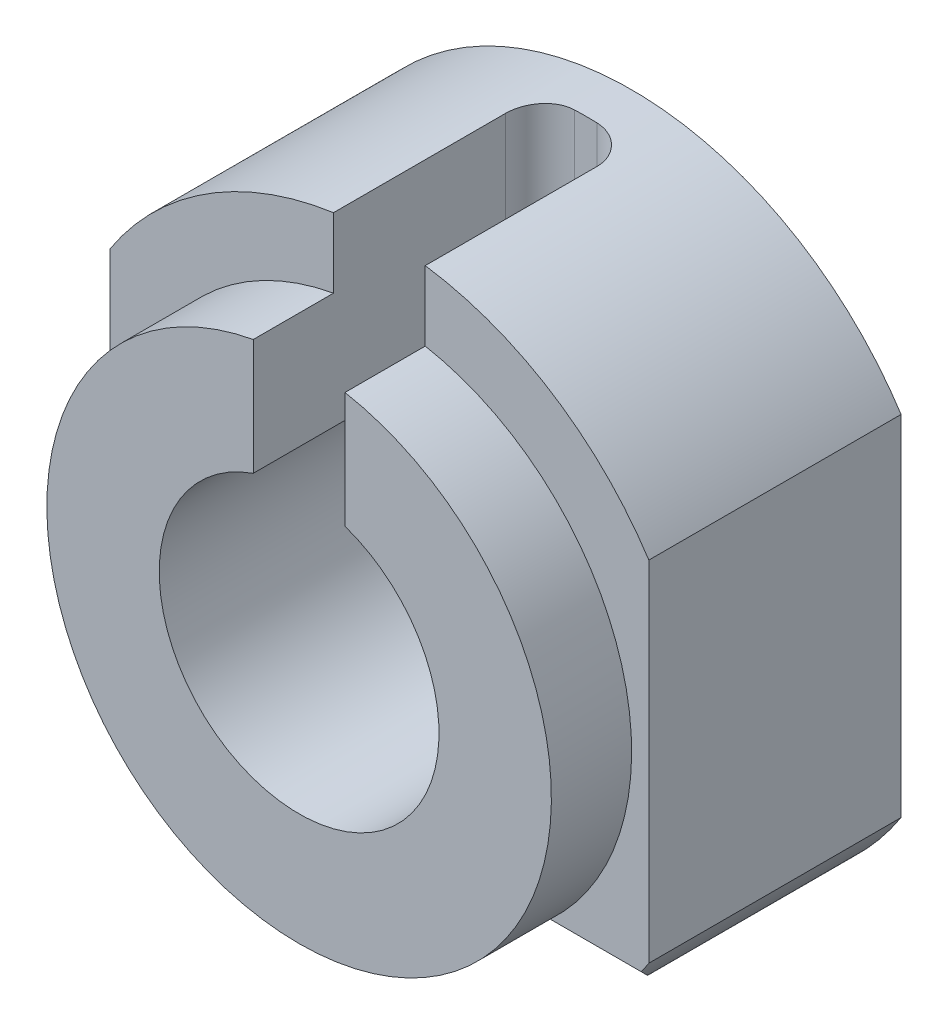
ISO-10303-21;
HEADER;
FILE_DESCRIPTION(('STEP AP214'),'2;1');
FILE_NAME('part.step','',(''),(''),'','','');
FILE_SCHEMA(('AUTOMOTIVE_DESIGN { 1 0 10303 214 1 1 1 1 }'));
ENDSEC;
DATA;
#1=APPLICATION_CONTEXT('core data for automotive mechanical design processes');
#2=APPLICATION_PROTOCOL_DEFINITION('international standard','automotive_design',2000,#1);
#3=PRODUCT_CONTEXT('',#1,'mechanical');
#4=PRODUCT('Part','Part','',(#3));
#5=PRODUCT_RELATED_PRODUCT_CATEGORY('part','',(#4));
#6=PRODUCT_DEFINITION_FORMATION('','',#4);
#7=PRODUCT_DEFINITION_CONTEXT('part definition',#1,'design');
#8=PRODUCT_DEFINITION('design','',#6,#7);
#9=PRODUCT_DEFINITION_SHAPE('','',#8);
#10=(LENGTH_UNIT() NAMED_UNIT(*) SI_UNIT(.MILLI.,.METRE.));
#11=(NAMED_UNIT(*) PLANE_ANGLE_UNIT() SI_UNIT($,.RADIAN.));
#12=(NAMED_UNIT(*) SI_UNIT($,.STERADIAN.) SOLID_ANGLE_UNIT());
#13=UNCERTAINTY_MEASURE_WITH_UNIT(LENGTH_MEASURE(1.E-05),#10,'distance_accuracy_value','');
#14=(GEOMETRIC_REPRESENTATION_CONTEXT(3) GLOBAL_UNCERTAINTY_ASSIGNED_CONTEXT((#13)) GLOBAL_UNIT_ASSIGNED_CONTEXT((#10,
#11,#12)) REPRESENTATION_CONTEXT('',''));
#15=CARTESIAN_POINT('',(0.,0.,0.));
#16=DIRECTION('',(0.,0.,1.));
#17=DIRECTION('',(1.,0.,0.));
#18=AXIS2_PLACEMENT_3D('',#15,#16,#17);
#19=CARTESIAN_POINT('',(0.,0.,5.));
#20=DIRECTION('',(0.,0.,1.));
#21=DIRECTION('',(1.,0.,0.));
#22=AXIS2_PLACEMENT_3D('',#19,#20,#21);
#23=CYLINDRICAL_SURFACE('',#22,14.);
#24=CARTESIAN_POINT('',(0.,0.,-2.));
#25=DIRECTION('',(0.,0.,-1.));
#26=DIRECTION('',(-1.,0.,0.));
#27=AXIS2_PLACEMENT_3D('',#24,#25,#26);
#28=CIRCLE('',#27,14.);
#29=CARTESIAN_POINT('',(11.75,-7.61166867381916,-2.));
#30=VERTEX_POINT('',#29);
#31=CARTESIAN_POINT('',(7.04201675658317,-12.1000000000001,-2.));
#32=VERTEX_POINT('',#31);
#33=EDGE_CURVE('E198',#30,#32,#28,.T.);
#34=ORIENTED_EDGE('',*,*,#33,.F.);
#35=DIRECTION('',(0.,0.,1.));
#36=VECTOR('',#35,1.);
#37=CARTESIAN_POINT('',(11.75,-7.61166867381916,5.));
#38=LINE('',#37,#36);
#39=CARTESIAN_POINT('',(11.75,-7.61166867381916,9.));
#40=VERTEX_POINT('',#39);
#41=EDGE_CURVE('E221',#30,#40,#38,.T.);
#42=ORIENTED_EDGE('',*,*,#41,.T.);
#43=CARTESIAN_POINT('',(0.,0.,9.));
#44=DIRECTION('',(0.,0.,-1.));
#45=DIRECTION('',(-1.,0.,0.));
#46=AXIS2_PLACEMENT_3D('',#43,#44,#45);
#47=CIRCLE('',#46,14.);
#48=CARTESIAN_POINT('',(11.4188440745988,-8.10000000000003,9.));
#49=VERTEX_POINT('',#48);
#50=EDGE_CURVE('E239',#40,#49,#47,.T.);
#51=ORIENTED_EDGE('',*,*,#50,.T.);
#52=CARTESIAN_POINT('',(0.,0.,17.0999999999999));
#53=DIRECTION('',(0.,-0.707106781186544,0.707106781186551));
#54=DIRECTION('',(0.,0.707106781186551,0.707106781186544));
#55=AXIS2_PLACEMENT_3D('',#52,#53,#54);
#56=ELLIPSE('',#55,19.7989898732232,14.);
#57=CARTESIAN_POINT('',(7.04201675658317,-12.1000000000001,5.));
#58=VERTEX_POINT('',#57);
#59=EDGE_CURVE('E206',#58,#49,#56,.T.);
#60=ORIENTED_EDGE('',*,*,#59,.F.);
#61=DIRECTION('',(0.,0.,1.));
#62=VECTOR('',#61,1.);
#63=CARTESIAN_POINT('',(7.04201675658317,-12.1000000000001,-37.0140691200743));
#64=LINE('',#63,#62);
#65=EDGE_CURVE('E157',#32,#58,#64,.T.);
#66=ORIENTED_EDGE('',*,*,#65,.F.);
#67=EDGE_LOOP('',(#34,#42,#51,#60,#66));
#68=FACE_BOUND('',#67,.T.);
#69=ADVANCED_FACE('F37',(#68),#23,.T.);
#70=DIRECTION('',(0.,0.,1.));
#71=VECTOR('',#70,1.);
#72=CARTESIAN_POINT('',(11.75,7.61166867381917,5.));
#73=LINE('',#72,#71);
#74=CARTESIAN_POINT('',(11.75,7.61166867381917,9.));
#75=VERTEX_POINT('',#74);
#76=CARTESIAN_POINT('',(11.75,7.61166867381917,-2.));
#77=VERTEX_POINT('',#76);
#78=EDGE_CURVE('E219',#75,#77,#73,.F.);
#79=ORIENTED_EDGE('',*,*,#78,.T.);
#80=CARTESIAN_POINT('',(-11.75,7.61166867381916,-2.));
#81=VERTEX_POINT('',#80);
#82=EDGE_CURVE('E194',#81,#77,#28,.T.);
#83=ORIENTED_EDGE('',*,*,#82,.F.);
#84=DIRECTION('',(0.,0.,1.));
#85=VECTOR('',#84,1.);
#86=CARTESIAN_POINT('',(-11.75,7.61166867381916,5.));
#87=LINE('',#86,#85);
#88=CARTESIAN_POINT('',(-11.75,7.61166867381916,9.));
#89=VERTEX_POINT('',#88);
#90=EDGE_CURVE('E225',#81,#89,#87,.T.);
#91=ORIENTED_EDGE('',*,*,#90,.T.);
#92=CARTESIAN_POINT('',(-2.,13.856406460551,9.));
#93=VERTEX_POINT('',#92);
#94=EDGE_CURVE('E234',#89,#93,#47,.T.);
#95=ORIENTED_EDGE('',*,*,#94,.T.);
#96=DIRECTION('',(0.,0.,1.));
#97=VECTOR('',#96,1.);
#98=CARTESIAN_POINT('',(-2.,13.856406460551,5.));
#99=LINE('',#98,#97);
#100=CARTESIAN_POINT('',(-2.,13.856406460551,1.5));
#101=VERTEX_POINT('',#100);
#102=EDGE_CURVE('E217',#93,#101,#99,.F.);
#103=ORIENTED_EDGE('',*,*,#102,.T.);
#104=CARTESIAN_POINT('',(-2.,13.856406460551,1.5));
#105=CARTESIAN_POINT('',(-1.99999996969438,13.8564053552044,1.45804671519508));
#106=CARTESIAN_POINT('',(-1.99823880810662,13.8566607893579,1.41611371587048));
#107=CARTESIAN_POINT('',(-1.99121446720279,13.8576723718009,1.33255161784717));
#108=CARTESIAN_POINT('',(-1.9859515746386,13.8584284790909,1.29092249454664));
#109=CARTESIAN_POINT('',(-1.96496882353167,13.8614252465925,1.16704436112621));
#110=CARTESIAN_POINT('',(-1.9440546983256,13.864394452771,1.08563119312014));
#111=CARTESIAN_POINT('',(-1.88898688108115,13.872003875857,0.927517543166502));
#112=CARTESIAN_POINT('',(-1.85482896585521,13.8766446257537,0.850818573532759));
#113=CARTESIAN_POINT('',(-1.77426564299377,13.8871748578926,0.704237988815018));
#114=CARTESIAN_POINT('',(-1.72786070284945,13.8930642924686,0.634356113649565));
#115=CARTESIAN_POINT('',(-1.62379820592946,13.9056116213672,0.502930635499084));
#116=CARTESIAN_POINT('',(-1.5660741648503,13.9122739561183,0.441440126698093));
#117=CARTESIAN_POINT('',(-1.44115141335215,13.9257682580944,0.328975724174143));
#118=CARTESIAN_POINT('',(-1.37395069152519,13.9326002610768,0.278004068730755));
#119=CARTESIAN_POINT('',(-1.23147755769111,13.945917342833,0.187710928652731));
#120=CARTESIAN_POINT('',(-1.1561548541417,13.9523998376109,0.148468462260823));
#121=CARTESIAN_POINT('',(-0.999929937748335,13.9644642128285,0.0832345946288487));
#122=CARTESIAN_POINT('',(-0.919031213808003,13.9700466492602,0.057234991291609));
#123=CARTESIAN_POINT('',(-0.781389076027023,13.9782863257302,0.0255414096224646));
#124=CARTESIAN_POINT('',(-0.725528375591962,13.9812998004014,0.0159732656932262));
#125=CARTESIAN_POINT('',(-0.613124371310071,13.9866820492969,0.00320229977263978));
#126=CARTESIAN_POINT('',(-0.556582002280132,13.9890516202538,-8.41978791379964E-06));
#127=CARTESIAN_POINT('',(-0.500000000000001,13.9910685796332,0.));
#128=B_SPLINE_CURVE_WITH_KNOTS('',3,(#104,#105,#106,#107,#108,#109,#110,#111,#112,#113,#114,
#115,#116,#117,#118,#119,#120,#121,#122,#123,#124,#125,#126,#127),.UNSPECIFIED.,.F.,.F.,(4,2,2,
2,2,2,2,2,2,2,2,4),(0.,0.12578193918261,0.251553579525045,0.502583346678074,0.753693228273852,
1.00479352593527,1.25741543510166,1.51009104372855,1.76443240009941,2.01861603551636,
2.18853731375438,2.35824737294954),.UNSPECIFIED.);
#129=CARTESIAN_POINT('',(-0.500000000000001,13.9910685796332,0.));
#130=VERTEX_POINT('',#129);
#131=EDGE_CURVE('E11',#101,#130,#128,.T.);
#132=ORIENTED_EDGE('',*,*,#131,.T.);
#133=CARTESIAN_POINT('',(0.,0.,0.));
#134=DIRECTION('',(0.,0.,1.));
#135=DIRECTION('',(1.,0.,0.));
#136=AXIS2_PLACEMENT_3D('',#133,#134,#135);
#137=CIRCLE('',#136,14.);
#138=CARTESIAN_POINT('',(0.500000000000001,13.9910685796332,0.));
#139=VERTEX_POINT('',#138);
#140=EDGE_CURVE('E181',#139,#130,#137,.T.);
#141=ORIENTED_EDGE('',*,*,#140,.F.);
#142=CARTESIAN_POINT('',(0.500000000000001,13.9910685796332,0.));
#143=CARTESIAN_POINT('',(0.542196769448139,13.9895616615297,1.50829216287733E-07));
#144=CARTESIAN_POINT('',(0.584366037789858,13.9878622023236,0.00178166461892763));
#145=CARTESIAN_POINT('',(0.668385486471884,13.9840990020537,0.00888451884244008));
#146=CARTESIAN_POINT('',(0.710235693171798,13.9820352914307,0.0142055635774201));
#147=CARTESIAN_POINT('',(0.834762890896998,13.9753371214589,0.0354169544724672));
#148=CARTESIAN_POINT('',(0.916580239372008,13.9701896854263,0.0565557581881711));
#149=CARTESIAN_POINT('',(1.07543506193921,13.9588610512571,0.112206765168652));
#150=CARTESIAN_POINT('',(1.15247103370214,13.9526795304385,0.146723147294667));
#151=CARTESIAN_POINT('',(1.29964698514619,13.9397408962441,0.228138140199843));
#152=CARTESIAN_POINT('',(1.3697873688276,13.9329838166327,0.275036024974674));
#153=CARTESIAN_POINT('',(1.50153335102422,13.919404187038,0.380148644957144));
#154=CARTESIAN_POINT('',(1.56309776110874,13.9125814787268,0.438414971786226));
#155=CARTESIAN_POINT('',(1.67559065955328,13.8994824022407,0.564518641033091));
#156=CARTESIAN_POINT('',(1.72651722287645,13.8932061330698,0.632357712030432));
#157=CARTESIAN_POINT('',(1.81629130220528,13.8817557528817,0.77574882056903));
#158=CARTESIAN_POINT('',(1.85513071605794,13.8765823818782,0.851305986767502));
#159=CARTESIAN_POINT('',(1.91952170694457,13.8678224427945,1.00794691363851));
#160=CARTESIAN_POINT('',(1.94508227962551,13.8642348007213,1.08902689069855));
#161=CARTESIAN_POINT('',(1.97570800035273,13.8598963273813,1.22551956259792));
#162=CARTESIAN_POINT('',(1.98481029694429,13.8585927350769,1.28004276246437));
#163=CARTESIAN_POINT('',(1.9969562518293,13.8568458365893,1.38970242283626));
#164=CARTESIAN_POINT('',(2.00000765216573,13.8564014311061,1.44483800880037));
#165=CARTESIAN_POINT('',(2.,13.856406460551,1.5));
#166=B_SPLINE_CURVE_WITH_KNOTS('',3,(#142,#143,#144,#145,#146,#147,#148,#149,#150,#151,#152,
#153,#154,#155,#156,#157,#158,#159,#160,#161,#162,#163,#164,#165),.UNSPECIFIED.,.F.,.F.,(4,2,2,
2,2,2,2,2,2,2,2,4),(0.,0.126592292451951,0.253174010482669,0.505852080150541,0.758609144589632,
1.01135139160399,1.2652684793075,1.51923147640596,1.77336434292068,2.02732482387473,
2.1928856021312,2.35823441049395),.UNSPECIFIED.);
#167=CARTESIAN_POINT('',(2.,13.856406460551,1.5));
#168=VERTEX_POINT('',#167);
#169=EDGE_CURVE('E272',#139,#168,#166,.T.);
#170=ORIENTED_EDGE('',*,*,#169,.T.);
#171=DIRECTION('',(0.,0.,1.));
#172=VECTOR('',#171,1.);
#173=CARTESIAN_POINT('',(2.,13.856406460551,5.));
#174=LINE('',#173,#172);
#175=CARTESIAN_POINT('',(2.,13.856406460551,9.));
#176=VERTEX_POINT('',#175);
#177=EDGE_CURVE('E211',#176,#168,#174,.F.);
#178=ORIENTED_EDGE('',*,*,#177,.F.);
#179=EDGE_CURVE('E238',#176,#75,#47,.T.);
#180=ORIENTED_EDGE('',*,*,#179,.T.);
#181=EDGE_LOOP('',(#79,#83,#91,#95,#103,#132,#141,#170,#178,#180));
#182=FACE_BOUND('',#181,.T.);
#183=ADVANCED_FACE('F291',(#182),#23,.T.);
#184=CARTESIAN_POINT('',(0.,0.,9.));
#185=DIRECTION('',(0.,0.,1.));
#186=DIRECTION('',(1.,0.,0.));
#187=AXIS2_PLACEMENT_3D('',#184,#185,#186);
#188=CYLINDRICAL_SURFACE('',#187,11.);
#189=DIRECTION('',(0.,0.,1.));
#190=VECTOR('',#189,1.);
#191=CARTESIAN_POINT('',(-2.,10.816653826392,9.));
#192=LINE('',#191,#190);
#193=CARTESIAN_POINT('',(-2.,10.816653826392,9.));
#194=VERTEX_POINT('',#193);
#195=CARTESIAN_POINT('',(-2.,10.816653826392,12.5));
#196=VERTEX_POINT('',#195);
#197=EDGE_CURVE('E158',#194,#196,#192,.T.);
#198=ORIENTED_EDGE('',*,*,#197,.F.);
#199=CARTESIAN_POINT('',(0.,0.,9.));
#200=DIRECTION('',(0.,0.,-1.));
#201=DIRECTION('',(-1.,0.,0.));
#202=AXIS2_PLACEMENT_3D('',#199,#200,#201);
#203=CIRCLE('',#202,11.);
#204=CARTESIAN_POINT('',(-7.44244583453581,-8.10000000000003,9.));
#205=VERTEX_POINT('',#204);
#206=EDGE_CURVE('E240',#194,#205,#203,.F.);
#207=ORIENTED_EDGE('',*,*,#206,.T.);
#208=CARTESIAN_POINT('',(0.,0.,17.1));
#209=DIRECTION('',(0.,-0.707106781186544,0.707106781186551));
#210=DIRECTION('',(0.,0.707106781186551,0.707106781186544));
#211=AXIS2_PLACEMENT_3D('',#208,#209,#210);
#212=ELLIPSE('',#211,15.556349186104,11.);
#213=CARTESIAN_POINT('',(7.44244583453581,-8.10000000000003,9.));
#214=VERTEX_POINT('',#213);
#215=EDGE_CURVE('E254',#205,#214,#212,.T.);
#216=ORIENTED_EDGE('',*,*,#215,.T.);
#217=CARTESIAN_POINT('',(2.,10.816653826392,9.));
#218=VERTEX_POINT('',#217);
#219=EDGE_CURVE('E237',#214,#218,#203,.F.);
#220=ORIENTED_EDGE('',*,*,#219,.T.);
#221=DIRECTION('',(0.,0.,1.));
#222=VECTOR('',#221,1.);
#223=CARTESIAN_POINT('',(2.,10.816653826392,9.));
#224=LINE('',#223,#222);
#225=CARTESIAN_POINT('',(2.,10.816653826392,12.5));
#226=VERTEX_POINT('',#225);
#227=EDGE_CURVE('E189',#218,#226,#224,.T.);
#228=ORIENTED_EDGE('',*,*,#227,.T.);
#229=CARTESIAN_POINT('',(0.,0.,12.5));
#230=DIRECTION('',(0.,0.,1.));
#231=DIRECTION('',(1.,0.,0.));
#232=AXIS2_PLACEMENT_3D('',#229,#230,#231);
#233=CIRCLE('',#232,11.);
#234=EDGE_CURVE('E167',#196,#226,#233,.T.);
#235=ORIENTED_EDGE('',*,*,#234,.F.);
#236=EDGE_LOOP('',(#198,#207,#216,#220,#228,#235));
#237=FACE_BOUND('',#236,.T.);
#238=ADVANCED_FACE('F282',(#237),#188,.T.);
#239=CARTESIAN_POINT('',(0.,0.,12.));
#240=DIRECTION('',(0.,0.,-1.));
#241=DIRECTION('',(-1.,0.,0.));
#242=AXIS2_PLACEMENT_3D('',#239,#240,#241);
#243=CYLINDRICAL_SURFACE('',#242,6.1);
#244=DIRECTION('',(0.,0.,-1.));
#245=VECTOR('',#244,1.);
#246=CARTESIAN_POINT('',(-2.,5.76281181368956,12.));
#247=LINE('',#246,#245);
#248=CARTESIAN_POINT('',(-2.,5.76281181368956,12.5));
#249=VERTEX_POINT('',#248);
#250=CARTESIAN_POINT('',(-2.,5.76281181368956,1.5));
#251=VERTEX_POINT('',#250);
#252=EDGE_CURVE('E151',#249,#251,#247,.T.);
#253=ORIENTED_EDGE('',*,*,#252,.F.);
#254=CARTESIAN_POINT('',(0.,0.,12.5));
#255=DIRECTION('',(0.,0.,-1.));
#256=DIRECTION('',(1.,0.,0.));
#257=AXIS2_PLACEMENT_3D('',#254,#255,#256);
#258=CIRCLE('',#257,6.1);
#259=CARTESIAN_POINT('',(2.,5.76281181368956,12.5));
#260=VERTEX_POINT('',#259);
#261=EDGE_CURVE('E156',#260,#249,#258,.T.);
#262=ORIENTED_EDGE('',*,*,#261,.F.);
#263=DIRECTION('',(0.,0.,-1.));
#264=VECTOR('',#263,1.);
#265=CARTESIAN_POINT('',(2.,5.76281181368956,12.));
#266=LINE('',#265,#264);
#267=CARTESIAN_POINT('',(2.,5.76281181368956,1.5));
#268=VERTEX_POINT('',#267);
#269=EDGE_CURVE('E191',#260,#268,#266,.T.);
#270=ORIENTED_EDGE('',*,*,#269,.T.);
#271=CARTESIAN_POINT('',(2.,5.76281181368956,1.5));
#272=CARTESIAN_POINT('',(2.00000103042488,5.76280879387298,1.45912730280613));
#273=CARTESIAN_POINT('',(1.99832833014286,5.76339224411861,1.4182752709187));
#274=CARTESIAN_POINT('',(1.99166388282136,5.76569974726263,1.33688485060621));
#275=CARTESIAN_POINT('',(1.98667292342789,5.76742352948309,1.29634639005914));
#276=CARTESIAN_POINT('',(1.96681301034085,5.77424051451865,1.17587741432361));
#277=CARTESIAN_POINT('',(1.94705652671565,5.78097983833655,1.09678802533307));
#278=CARTESIAN_POINT('',(1.89522183898237,5.79817803127837,0.943288184459561));
#279=CARTESIAN_POINT('',(1.86314857267273,5.80863540970971,0.868875871430377));
#280=CARTESIAN_POINT('',(1.78768853252168,5.83230048163174,0.72646664648126));
#281=CARTESIAN_POINT('',(1.74429582602121,5.84550961661884,0.65847312425509));
#282=CARTESIAN_POINT('',(1.64583686826946,5.87400413283441,0.528443176698229));
#283=CARTESIAN_POINT('',(1.59043936061596,5.88934272304996,0.466669487034393));
#284=CARTESIAN_POINT('',(1.47029798299624,5.92047890655348,0.353109973309174));
#285=CARTESIAN_POINT('',(1.405551330156,5.93627663538675,0.301327133891929));
#286=CARTESIAN_POINT('',(1.26580314965512,5.96766688059151,0.207371371176681));
#287=CARTESIAN_POINT('',(1.19051525906998,5.98323127040053,0.165614144498679));
#288=CARTESIAN_POINT('',(1.03360751239854,6.01232115309283,0.0954949380790908));
#289=CARTESIAN_POINT('',(0.951992677564216,6.02584823825096,0.0671224599871422));
#290=CARTESIAN_POINT('',(0.808425183344549,6.04649623152314,0.0307476684761042));
#291=CARTESIAN_POINT('',(0.747440627478785,6.05434690298553,0.0192535648570485));
#292=CARTESIAN_POINT('',(0.624344467735915,6.06828505633752,0.00387293473045159));
#293=CARTESIAN_POINT('',(0.56223323667046,6.07437311055439,-1.60635438088193E-05));
#294=CARTESIAN_POINT('',(0.500000000000001,6.07947366142826,0.));
#295=B_SPLINE_CURVE_WITH_KNOTS('',3,(#271,#272,#273,#274,#275,#276,#277,#278,#279,#280,#281,
#282,#283,#284,#285,#286,#287,#288,#289,#290,#291,#292,#293,#294),.UNSPECIFIED.,.F.,.F.,(4,2,2,
2,2,2,2,2,2,2,2,4),(0.,0.122539277682988,0.245049478935594,0.489166193589522,0.733185143843447,
0.977332245318422,1.22935077209324,1.4814444701377,1.74266319299319,2.00367668643745,
2.19086225132186,2.37798696813421),.UNSPECIFIED.);
#296=CARTESIAN_POINT('',(0.500000000000001,6.07947366142826,0.));
#297=VERTEX_POINT('',#296);
#298=EDGE_CURVE('E265',#268,#297,#295,.T.);
#299=ORIENTED_EDGE('',*,*,#298,.T.);
#300=CARTESIAN_POINT('',(0.,0.,0.));
#301=DIRECTION('',(0.,0.,1.));
#302=DIRECTION('',(1.,0.,0.));
#303=AXIS2_PLACEMENT_3D('',#300,#301,#302);
#304=CIRCLE('',#303,6.1);
#305=CARTESIAN_POINT('',(-0.500000000000001,6.07947366142827,0.));
#306=VERTEX_POINT('',#305);
#307=EDGE_CURVE('E243',#306,#297,#304,.T.);
#308=ORIENTED_EDGE('',*,*,#307,.F.);
#309=CARTESIAN_POINT('',(-0.500000000000001,6.07947366142826,0.));
#310=CARTESIAN_POINT('',(-0.542155131473102,6.07600913165807,-3.92754625813818E-07));
#311=CARTESIAN_POINT('',(-0.584251576851117,6.07210253317941,0.00177806854636581));
#312=CARTESIAN_POINT('',(-0.668052047932988,6.06345413446,0.00885027833599632));
#313=CARTESIAN_POINT('',(-0.709756162389627,6.05871252814518,0.0141432113971118));
#314=CARTESIAN_POINT('',(-0.833644853604408,6.04333712642405,0.035188533958937));
#315=CARTESIAN_POINT('',(-0.914865812162902,6.03153104222239,0.056108020588079));
#316=CARTESIAN_POINT('',(-1.07228584570494,6.00554618916053,0.110955058802567));
#317=CARTESIAN_POINT('',(-1.14848679666012,5.99136831372733,0.144877718429692));
#318=CARTESIAN_POINT('',(-1.29406657308475,5.96162014363581,0.224715511483559));
#319=CARTESIAN_POINT('',(-1.3634425267573,5.94604926805326,0.270635663711695));
#320=CARTESIAN_POINT('',(-1.49526572326207,5.91429601578514,0.374537809213312));
#321=CARTESIAN_POINT('',(-1.5574974589407,5.89810806632302,0.432791641690995));
#322=CARTESIAN_POINT('',(-1.67135449514209,5.8668617626366,0.559169771456593));
#323=CARTESIAN_POINT('',(-1.72297791952537,5.85180360852142,0.62729581107324));
#324=CARTESIAN_POINT('',(-1.81433799615004,5.824128742111,0.772070516891001));
#325=CARTESIAN_POINT('',(-1.85401159074666,5.81152510122949,0.848761564596844));
#326=CARTESIAN_POINT('',(-1.91971368248425,5.79015570528214,1.00823880778288));
#327=CARTESIAN_POINT('',(-1.94575814186863,5.78138546258966,1.09101774297865));
#328=CARTESIAN_POINT('',(-1.97626573596569,5.77100751571734,1.22868788205585));
#329=CARTESIAN_POINT('',(-1.9851509215752,5.7679496068659,1.28252920586728));
#330=CARTESIAN_POINT('',(-1.99702165049108,5.76384564090719,1.39090266280633));
#331=CARTESIAN_POINT('',(-2.00001045101674,5.76279847305597,1.4454343977781));
#332=CARTESIAN_POINT('',(-2.,5.76281181368956,1.5));
#333=B_SPLINE_CURVE_WITH_KNOTS('',3,(#309,#310,#311,#312,#313,#314,#315,#316,#317,#318,#319,
#320,#321,#322,#323,#324,#325,#326,#327,#328,#329,#330,#331,#332),.UNSPECIFIED.,.F.,.F.,(4,2,2,
2,2,2,2,2,2,2,2,4),(0.,0.126809081433122,0.253588750907153,0.506375551620056,0.759067343930708,
1.01186501220922,1.27095657475655,1.53009391974189,1.79057566111001,2.05075164342552,
2.21438330833899,2.37792455622362),.UNSPECIFIED.);
#334=EDGE_CURVE('E50',#306,#251,#333,.T.);
#335=ORIENTED_EDGE('',*,*,#334,.T.);
#336=EDGE_LOOP('',(#253,#262,#270,#299,#308,#335));
#337=FACE_BOUND('',#336,.T.);
#338=ADVANCED_FACE('F153',(#337),#243,.F.);
#339=CARTESIAN_POINT('',(0.,0.,9.));
#340=DIRECTION('',(0.,0.,-1.));
#341=DIRECTION('',(-1.,0.,0.));
#342=AXIS2_PLACEMENT_3D('',#339,#340,#341);
#343=PLANE('',#342);
#344=DIRECTION('',(-1.,0.,0.));
#345=VECTOR('',#344,1.);
#346=CARTESIAN_POINT('',(0.,-8.10000000000003,9.));
#347=LINE('',#346,#345);
#348=EDGE_CURVE('E253',#49,#214,#347,.T.);
#349=ORIENTED_EDGE('',*,*,#348,.F.);
#350=ORIENTED_EDGE('',*,*,#50,.F.);
#351=DIRECTION('',(0.,1.,0.));
#352=VECTOR('',#351,1.);
#353=CARTESIAN_POINT('',(11.75,0.,9.));
#354=LINE('',#353,#352);
#355=EDGE_CURVE('E245',#40,#75,#354,.T.);
#356=ORIENTED_EDGE('',*,*,#355,.T.);
#357=ORIENTED_EDGE('',*,*,#179,.F.);
#358=DIRECTION('',(0.,1.,0.));
#359=VECTOR('',#358,1.);
#360=CARTESIAN_POINT('',(2.,0.,9.));
#361=LINE('',#360,#359);
#362=EDGE_CURVE('E209',#218,#176,#361,.T.);
#363=ORIENTED_EDGE('',*,*,#362,.F.);
#364=ORIENTED_EDGE('',*,*,#219,.F.);
#365=EDGE_LOOP('',(#349,#350,#356,#357,#363,#364));
#366=FACE_BOUND('',#365,.T.);
#367=ADVANCED_FACE('F281',(#366),#343,.F.);
#368=CARTESIAN_POINT('',(-11.4188440745988,-8.10000000000003,9.));
#369=VERTEX_POINT('',#368);
#370=EDGE_CURVE('E251',#205,#369,#347,.T.);
#371=ORIENTED_EDGE('',*,*,#370,.F.);
#372=ORIENTED_EDGE('',*,*,#206,.F.);
#373=DIRECTION('',(0.,1.,0.));
#374=VECTOR('',#373,1.);
#375=CARTESIAN_POINT('',(-2.,0.,9.));
#376=LINE('',#375,#374);
#377=EDGE_CURVE('E214',#194,#93,#376,.T.);
#378=ORIENTED_EDGE('',*,*,#377,.T.);
#379=ORIENTED_EDGE('',*,*,#94,.F.);
#380=DIRECTION('',(0.,-1.,0.));
#381=VECTOR('',#380,1.);
#382=CARTESIAN_POINT('',(-11.75,0.,9.));
#383=LINE('',#382,#381);
#384=CARTESIAN_POINT('',(-11.75,-7.61166867381916,9.));
#385=VERTEX_POINT('',#384);
#386=EDGE_CURVE('E248',#89,#385,#383,.T.);
#387=ORIENTED_EDGE('',*,*,#386,.T.);
#388=EDGE_CURVE('E231',#369,#385,#47,.T.);
#389=ORIENTED_EDGE('',*,*,#388,.F.);
#390=EDGE_LOOP('',(#371,#372,#378,#379,#387,#389));
#391=FACE_BOUND('',#390,.T.);
#392=ADVANCED_FACE('F323',(#391),#343,.F.);
#393=DIRECTION('',(0.,0.,1.));
#394=VECTOR('',#393,1.);
#395=CARTESIAN_POINT('',(-11.75,-7.61166867381916,5.));
#396=LINE('',#395,#394);
#397=CARTESIAN_POINT('',(-11.75,-7.61166867381916,-2.));
#398=VERTEX_POINT('',#397);
#399=EDGE_CURVE('E223',#385,#398,#396,.F.);
#400=ORIENTED_EDGE('',*,*,#399,.T.);
#401=CARTESIAN_POINT('',(-7.04201675658317,-12.1000000000001,-2.));
#402=VERTEX_POINT('',#401);
#403=EDGE_CURVE('E199',#402,#398,#28,.T.);
#404=ORIENTED_EDGE('',*,*,#403,.F.);
#405=DIRECTION('',(0.,0.,1.));
#406=VECTOR('',#405,1.);
#407=CARTESIAN_POINT('',(-7.04201675658317,-12.1000000000001,-37.0140691200743));
#408=LINE('',#407,#406);
#409=CARTESIAN_POINT('',(-7.04201675658317,-12.1000000000001,5.));
#410=VERTEX_POINT('',#409);
#411=EDGE_CURVE('E201',#402,#410,#408,.T.);
#412=ORIENTED_EDGE('',*,*,#411,.T.);
#413=EDGE_CURVE('E197',#369,#410,#56,.T.);
#414=ORIENTED_EDGE('',*,*,#413,.F.);
#415=ORIENTED_EDGE('',*,*,#388,.T.);
#416=EDGE_LOOP('',(#400,#404,#412,#414,#415));
#417=FACE_BOUND('',#416,.T.);
#418=ADVANCED_FACE('F313',(#417),#23,.T.);
#419=CARTESIAN_POINT('',(0.,0.,0.));
#420=DIRECTION('',(0.,0.,-1.));
#421=DIRECTION('',(-1.,0.,0.));
#422=AXIS2_PLACEMENT_3D('',#419,#420,#421);
#423=PLANE('',#422);
#424=ORIENTED_EDGE('',*,*,#307,.T.);
#425=DIRECTION('',(0.,-1.,0.));
#426=VECTOR('',#425,1.);
#427=CARTESIAN_POINT('',(0.500000000000001,0.,0.));
#428=LINE('',#427,#426);
#429=EDGE_CURVE('E262',#297,#139,#428,.F.);
#430=ORIENTED_EDGE('',*,*,#429,.T.);
#431=ORIENTED_EDGE('',*,*,#140,.T.);
#432=DIRECTION('',(0.,-1.,0.));
#433=VECTOR('',#432,1.);
#434=CARTESIAN_POINT('',(-0.500000000000001,5.76281181368956,0.));
#435=LINE('',#434,#433);
#436=EDGE_CURVE('E259',#130,#306,#435,.T.);
#437=ORIENTED_EDGE('',*,*,#436,.T.);
#438=EDGE_LOOP('',(#424,#430,#431,#437));
#439=FACE_BOUND('',#438,.T.);
#440=CARTESIAN_POINT('',(0.,0.,0.));
#441=DIRECTION('',(0.,0.,-1.));
#442=DIRECTION('',(-1.,0.,0.));
#443=AXIS2_PLACEMENT_3D('',#440,#441,#442);
#444=CIRCLE('',#443,1.5);
#445=CARTESIAN_POINT('',(-1.5,0.,0.));
#446=VERTEX_POINT('',#445);
#447=EDGE_CURVE('E227',#446,#446,#444,.T.);
#448=ORIENTED_EDGE('',*,*,#447,.T.);
#449=EDGE_LOOP('',(#448));
#450=FACE_BOUND('',#449,.T.);
#451=ADVANCED_FACE('F357',(#439,#450),#423,.F.);
#452=CARTESIAN_POINT('',(0.,0.,-2.));
#453=DIRECTION('',(0.,0.,-1.));
#454=DIRECTION('',(-1.,0.,0.));
#455=AXIS2_PLACEMENT_3D('',#452,#453,#454);
#456=PLANE('',#455);
#457=DIRECTION('',(0.,-1.,0.));
#458=VECTOR('',#457,1.);
#459=CARTESIAN_POINT('',(11.75,7.61166867381917,-2.));
#460=LINE('',#459,#458);
#461=EDGE_CURVE('E178',#77,#30,#460,.T.);
#462=ORIENTED_EDGE('',*,*,#461,.T.);
#463=ORIENTED_EDGE('',*,*,#33,.T.);
#464=DIRECTION('',(-1.,0.,0.));
#465=VECTOR('',#464,1.);
#466=CARTESIAN_POINT('',(7.04201675658317,-12.1000000000001,-2.));
#467=LINE('',#466,#465);
#468=EDGE_CURVE('E177',#32,#402,#467,.T.);
#469=ORIENTED_EDGE('',*,*,#468,.T.);
#470=ORIENTED_EDGE('',*,*,#403,.T.);
#471=DIRECTION('',(0.,1.,0.));
#472=VECTOR('',#471,1.);
#473=CARTESIAN_POINT('',(-11.75,-7.61166867381916,-2.));
#474=LINE('',#473,#472);
#475=EDGE_CURVE('E182',#398,#81,#474,.T.);
#476=ORIENTED_EDGE('',*,*,#475,.T.);
#477=ORIENTED_EDGE('',*,*,#82,.T.);
#478=EDGE_LOOP('',(#462,#463,#469,#470,#476,#477));
#479=FACE_BOUND('',#478,.T.);
#480=CARTESIAN_POINT('',(0.,0.,-2.));
#481=DIRECTION('',(0.,0.,-1.));
#482=DIRECTION('',(-1.,0.,0.));
#483=AXIS2_PLACEMENT_3D('',#480,#481,#482);
#484=CIRCLE('',#483,1.5);
#485=CARTESIAN_POINT('',(-1.5,0.,-2.));
#486=VERTEX_POINT('',#485);
#487=EDGE_CURVE('E228',#486,#486,#484,.T.);
#488=ORIENTED_EDGE('',*,*,#487,.F.);
#489=EDGE_LOOP('',(#488));
#490=FACE_BOUND('',#489,.T.);
#491=ADVANCED_FACE('F328',(#479,#490),#456,.T.);
#492=CARTESIAN_POINT('',(0.,0.,-2.));
#493=DIRECTION('',(0.,0.,1.));
#494=DIRECTION('',(1.,0.,0.));
#495=AXIS2_PLACEMENT_3D('',#492,#493,#494);
#496=CYLINDRICAL_SURFACE('',#495,1.5);
#497=ORIENTED_EDGE('',*,*,#487,.T.);
#498=EDGE_LOOP('',(#497));
#499=FACE_BOUND('',#498,.T.);
#500=ORIENTED_EDGE('',*,*,#447,.F.);
#501=EDGE_LOOP('',(#500));
#502=FACE_BOUND('',#501,.T.);
#503=ADVANCED_FACE('F370',(#499,#502),#496,.F.);
#504=CARTESIAN_POINT('',(11.75,0.,-2.));
#505=DIRECTION('',(-1.,0.,0.));
#506=DIRECTION('',(0.,-1.,0.));
#507=AXIS2_PLACEMENT_3D('',#504,#505,#506);
#508=PLANE('',#507);
#509=ORIENTED_EDGE('',*,*,#41,.F.);
#510=ORIENTED_EDGE('',*,*,#461,.F.);
#511=ORIENTED_EDGE('',*,*,#78,.F.);
#512=ORIENTED_EDGE('',*,*,#355,.F.);
#513=EDGE_LOOP('',(#509,#510,#511,#512));
#514=FACE_BOUND('',#513,.T.);
#515=ADVANCED_FACE('F373',(#514),#508,.F.);
#516=CARTESIAN_POINT('',(-11.75,0.,-2.));
#517=DIRECTION('',(1.,0.,0.));
#518=DIRECTION('',(0.,1.,0.));
#519=AXIS2_PLACEMENT_3D('',#516,#517,#518);
#520=PLANE('',#519);
#521=ORIENTED_EDGE('',*,*,#90,.F.);
#522=ORIENTED_EDGE('',*,*,#475,.F.);
#523=ORIENTED_EDGE('',*,*,#399,.F.);
#524=ORIENTED_EDGE('',*,*,#386,.F.);
#525=EDGE_LOOP('',(#521,#522,#523,#524));
#526=FACE_BOUND('',#525,.T.);
#527=ADVANCED_FACE('F320',(#526),#520,.F.);
#528=CARTESIAN_POINT('',(-2.,14.,0.));
#529=DIRECTION('',(-1.,0.,0.));
#530=DIRECTION('',(0.,0.,1.));
#531=AXIS2_PLACEMENT_3D('',#528,#529,#530);
#532=PLANE('',#531);
#533=ORIENTED_EDGE('',*,*,#252,.T.);
#534=DIRECTION('',(0.,-1.,0.));
#535=VECTOR('',#534,1.);
#536=CARTESIAN_POINT('',(-2.,13.856406460551,1.5));
#537=LINE('',#536,#535);
#538=EDGE_CURVE('E63',#251,#101,#537,.F.);
#539=ORIENTED_EDGE('',*,*,#538,.T.);
#540=ORIENTED_EDGE('',*,*,#102,.F.);
#541=ORIENTED_EDGE('',*,*,#377,.F.);
#542=ORIENTED_EDGE('',*,*,#197,.T.);
#543=DIRECTION('',(0.,1.,0.));
#544=VECTOR('',#543,1.);
#545=CARTESIAN_POINT('',(-2.,5.76281181368956,12.5));
#546=LINE('',#545,#544);
#547=EDGE_CURVE('E161',#249,#196,#546,.T.);
#548=ORIENTED_EDGE('',*,*,#547,.F.);
#549=EDGE_LOOP('',(#533,#539,#540,#541,#542,#548));
#550=FACE_BOUND('',#549,.T.);
#551=ADVANCED_FACE('F162',(#550),#532,.F.);
#552=CARTESIAN_POINT('',(2.,14.,0.));
#553=DIRECTION('',(-1.,0.,0.));
#554=DIRECTION('',(0.,0.,1.));
#555=AXIS2_PLACEMENT_3D('',#552,#553,#554);
#556=PLANE('',#555);
#557=ORIENTED_EDGE('',*,*,#177,.T.);
#558=DIRECTION('',(0.,-1.,0.));
#559=VECTOR('',#558,1.);
#560=CARTESIAN_POINT('',(2.,14.,1.5));
#561=LINE('',#560,#559);
#562=EDGE_CURVE('E256',#168,#268,#561,.T.);
#563=ORIENTED_EDGE('',*,*,#562,.T.);
#564=ORIENTED_EDGE('',*,*,#269,.F.);
#565=DIRECTION('',(0.,-1.,0.));
#566=VECTOR('',#565,1.);
#567=CARTESIAN_POINT('',(2.,10.816653826392,12.5));
#568=LINE('',#567,#566);
#569=EDGE_CURVE('E172',#226,#260,#568,.T.);
#570=ORIENTED_EDGE('',*,*,#569,.F.);
#571=ORIENTED_EDGE('',*,*,#227,.F.);
#572=ORIENTED_EDGE('',*,*,#362,.T.);
#573=EDGE_LOOP('',(#557,#563,#564,#570,#571,#572));
#574=FACE_BOUND('',#573,.T.);
#575=ADVANCED_FACE('F297',(#574),#556,.T.);
#576=CARTESIAN_POINT('',(-11.75,-8.54999999999998,8.55000000000006));
#577=DIRECTION('',(0.,-0.707106781186544,0.707106781186551));
#578=DIRECTION('',(0.,-0.707106781186551,-0.707106781186544));
#579=AXIS2_PLACEMENT_3D('',#576,#577,#578);
#580=PLANE('',#579);
#581=ORIENTED_EDGE('',*,*,#215,.F.);
#582=ORIENTED_EDGE('',*,*,#370,.T.);
#583=ORIENTED_EDGE('',*,*,#413,.T.);
#584=DIRECTION('',(-1.,0.,0.));
#585=VECTOR('',#584,1.);
#586=CARTESIAN_POINT('',(0.,-12.1000000000001,5.));
#587=LINE('',#586,#585);
#588=EDGE_CURVE('E205',#58,#410,#587,.T.);
#589=ORIENTED_EDGE('',*,*,#588,.F.);
#590=ORIENTED_EDGE('',*,*,#59,.T.);
#591=ORIENTED_EDGE('',*,*,#348,.T.);
#592=EDGE_LOOP('',(#581,#582,#583,#589,#590,#591));
#593=FACE_BOUND('',#592,.T.);
#594=ADVANCED_FACE('F340',(#593),#580,.T.);
#595=CARTESIAN_POINT('',(0.,-12.1000000000001,-37.0140691200743));
#596=DIRECTION('',(0.,1.,0.));
#597=DIRECTION('',(0.,0.,1.));
#598=AXIS2_PLACEMENT_3D('',#595,#596,#597);
#599=PLANE('',#598);
#600=ORIENTED_EDGE('',*,*,#411,.F.);
#601=ORIENTED_EDGE('',*,*,#468,.F.);
#602=ORIENTED_EDGE('',*,*,#65,.T.);
#603=ORIENTED_EDGE('',*,*,#588,.T.);
#604=EDGE_LOOP('',(#600,#601,#602,#603));
#605=FACE_BOUND('',#604,.T.);
#606=ADVANCED_FACE('F338',(#605),#599,.F.);
#607=CARTESIAN_POINT('',(0.500000000000001,14.,1.5));
#608=DIRECTION('',(0.,-1.,0.));
#609=DIRECTION('',(0.,0.,-1.));
#610=AXIS2_PLACEMENT_3D('',#607,#608,#609);
#611=CYLINDRICAL_SURFACE('',#610,1.5);
#612=ORIENTED_EDGE('',*,*,#169,.F.);
#613=ORIENTED_EDGE('',*,*,#429,.F.);
#614=ORIENTED_EDGE('',*,*,#298,.F.);
#615=ORIENTED_EDGE('',*,*,#562,.F.);
#616=EDGE_LOOP('',(#612,#613,#614,#615));
#617=FACE_BOUND('',#616,.T.);
#618=ADVANCED_FACE('F276',(#617),#611,.F.);
#619=CARTESIAN_POINT('',(-0.500000000000001,0.,1.5));
#620=DIRECTION('',(0.,1.,0.));
#621=DIRECTION('',(0.,0.,1.));
#622=AXIS2_PLACEMENT_3D('',#619,#620,#621);
#623=CYLINDRICAL_SURFACE('',#622,1.5);
#624=ORIENTED_EDGE('',*,*,#131,.F.);
#625=ORIENTED_EDGE('',*,*,#538,.F.);
#626=ORIENTED_EDGE('',*,*,#334,.F.);
#627=ORIENTED_EDGE('',*,*,#436,.F.);
#628=EDGE_LOOP('',(#624,#625,#626,#627));
#629=FACE_BOUND('',#628,.T.);
#630=ADVANCED_FACE('F39',(#629),#623,.F.);
#631=CARTESIAN_POINT('',(0.,0.,12.5));
#632=DIRECTION('',(0.,0.,1.));
#633=DIRECTION('',(1.,0.,0.));
#634=AXIS2_PLACEMENT_3D('',#631,#632,#633);
#635=PLANE('',#634);
#636=ORIENTED_EDGE('',*,*,#261,.T.);
#637=ORIENTED_EDGE('',*,*,#547,.T.);
#638=ORIENTED_EDGE('',*,*,#234,.T.);
#639=ORIENTED_EDGE('',*,*,#569,.T.);
#640=EDGE_LOOP('',(#636,#637,#638,#639));
#641=FACE_BOUND('',#640,.T.);
#642=ADVANCED_FACE('F170',(#641),#635,.T.);
#643=CLOSED_SHELL('',(#69,#183,#238,#338,#367,#392,#418,#451,#491,#503,#515,#527,#551,#575,#594,
#606,#618,#630,#642));
#644=MANIFOLD_SOLID_BREP('B2',#643);
#645=ADVANCED_BREP_SHAPE_REPRESENTATION('',(#18,#644),#14);
#646=SHAPE_DEFINITION_REPRESENTATION(#9,#645);
ENDSEC;
END-ISO-10303-21;
